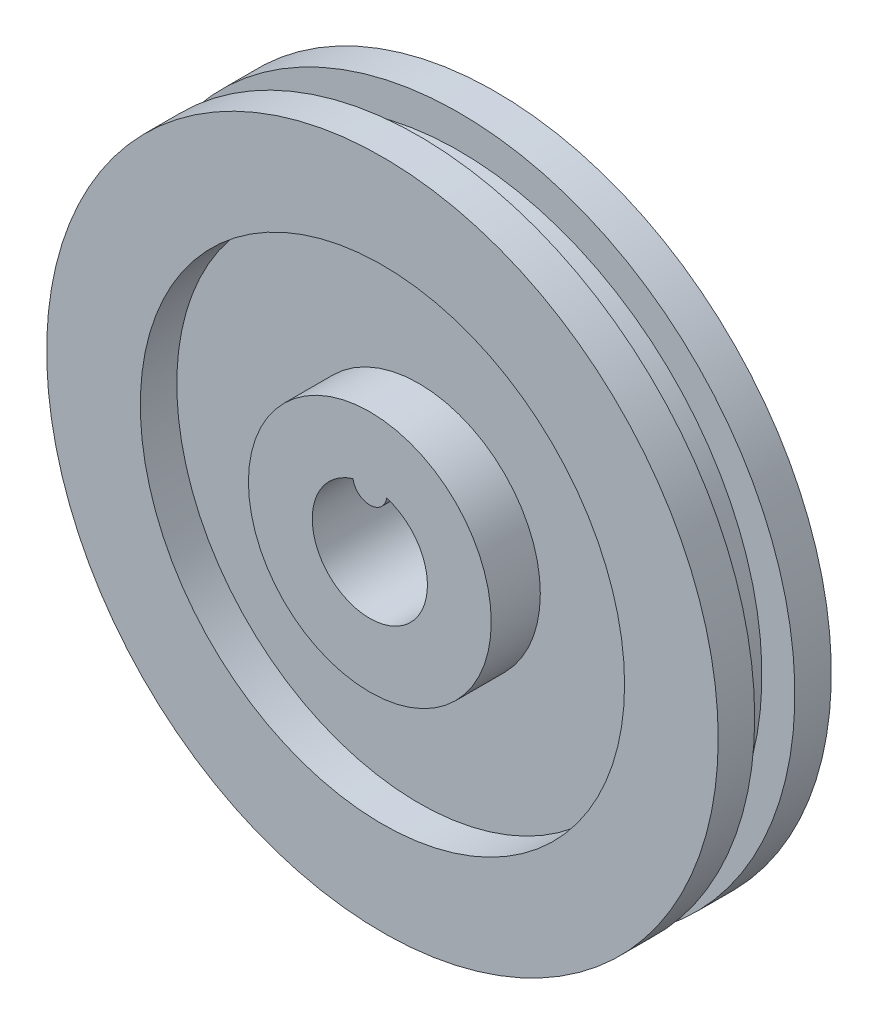
ISO-10303-21;
HEADER;
FILE_DESCRIPTION(('STEP AP214'),'2;1');
FILE_NAME('part.step','',(''),(''),'','','');
FILE_SCHEMA(('AUTOMOTIVE_DESIGN { 1 0 10303 214 1 1 1 1 }'));
ENDSEC;
DATA;
#1=APPLICATION_CONTEXT('core data for automotive mechanical design processes');
#2=APPLICATION_PROTOCOL_DEFINITION('international standard','automotive_design',2000,#1);
#3=PRODUCT_CONTEXT('',#1,'mechanical');
#4=PRODUCT('Part','Part','',(#3));
#5=PRODUCT_RELATED_PRODUCT_CATEGORY('part','',(#4));
#6=PRODUCT_DEFINITION_FORMATION('','',#4);
#7=PRODUCT_DEFINITION_CONTEXT('part definition',#1,'design');
#8=PRODUCT_DEFINITION('design','',#6,#7);
#9=PRODUCT_DEFINITION_SHAPE('','',#8);
#10=(LENGTH_UNIT() NAMED_UNIT(*) SI_UNIT(.MILLI.,.METRE.));
#11=(NAMED_UNIT(*) PLANE_ANGLE_UNIT() SI_UNIT($,.RADIAN.));
#12=(NAMED_UNIT(*) SI_UNIT($,.STERADIAN.) SOLID_ANGLE_UNIT());
#13=UNCERTAINTY_MEASURE_WITH_UNIT(LENGTH_MEASURE(1.E-05),#10,'distance_accuracy_value','');
#14=(GEOMETRIC_REPRESENTATION_CONTEXT(3) GLOBAL_UNCERTAINTY_ASSIGNED_CONTEXT((#13)) GLOBAL_UNIT_ASSIGNED_CONTEXT((#10,
#11,#12)) REPRESENTATION_CONTEXT('',''));
#15=CARTESIAN_POINT('',(0.,0.,0.));
#16=DIRECTION('',(0.,0.,1.));
#17=DIRECTION('',(1.,0.,0.));
#18=AXIS2_PLACEMENT_3D('',#15,#16,#17);
#19=CARTESIAN_POINT('',(0.,0.,-1.465));
#20=DIRECTION('',(0.,0.,1.));
#21=DIRECTION('',(1.,0.,0.));
#22=AXIS2_PLACEMENT_3D('',#19,#20,#21);
#23=PLANE('',#22);
#24=CARTESIAN_POINT('',(0.,0.,-1.465));
#25=DIRECTION('',(0.,0.,1.));
#26=DIRECTION('',(1.,0.,0.));
#27=AXIS2_PLACEMENT_3D('',#24,#25,#26);
#28=CIRCLE('',#27,8.855);
#29=CARTESIAN_POINT('',(8.855,0.,-1.465));
#30=VERTEX_POINT('',#29);
#31=EDGE_CURVE('E54',#30,#30,#28,.T.);
#32=ORIENTED_EDGE('',*,*,#31,.T.);
#33=EDGE_LOOP('',(#32));
#34=FACE_BOUND('',#33,.T.);
#35=CARTESIAN_POINT('',(0.,0.,-1.465));
#36=DIRECTION('',(0.,0.,-1.));
#37=DIRECTION('',(-1.,0.,0.));
#38=AXIS2_PLACEMENT_3D('',#35,#36,#37);
#39=CIRCLE('',#38,17.66);
#40=CARTESIAN_POINT('',(-17.66,0.,-1.465));
#41=VERTEX_POINT('',#40);
#42=EDGE_CURVE('E267',#41,#41,#39,.T.);
#43=ORIENTED_EDGE('',*,*,#42,.T.);
#44=EDGE_LOOP('',(#43));
#45=FACE_BOUND('',#44,.T.);
#46=ADVANCED_FACE('F45',(#34,#45),#23,.F.);
#47=CARTESIAN_POINT('',(0.,0.,1.465));
#48=DIRECTION('',(0.,0.,1.));
#49=DIRECTION('',(1.,0.,0.));
#50=AXIS2_PLACEMENT_3D('',#47,#48,#49);
#51=PLANE('',#50);
#52=CARTESIAN_POINT('',(0.,0.,1.465));
#53=DIRECTION('',(0.,0.,1.));
#54=DIRECTION('',(1.,0.,0.));
#55=AXIS2_PLACEMENT_3D('',#52,#53,#54);
#56=CIRCLE('',#55,8.855);
#57=CARTESIAN_POINT('',(8.855,0.,1.465));
#58=VERTEX_POINT('',#57);
#59=EDGE_CURVE('E93',#58,#58,#56,.T.);
#60=ORIENTED_EDGE('',*,*,#59,.F.);
#61=EDGE_LOOP('',(#60));
#62=FACE_BOUND('',#61,.T.);
#63=CARTESIAN_POINT('',(0.,0.,1.465));
#64=DIRECTION('',(0.,0.,1.));
#65=DIRECTION('',(1.,0.,0.));
#66=AXIS2_PLACEMENT_3D('',#63,#64,#65);
#67=CIRCLE('',#66,17.66);
#68=CARTESIAN_POINT('',(17.66,0.,1.465));
#69=VERTEX_POINT('',#68);
#70=EDGE_CURVE('E11',#69,#69,#67,.F.);
#71=ORIENTED_EDGE('',*,*,#70,.F.);
#72=EDGE_LOOP('',(#71));
#73=FACE_BOUND('',#72,.T.);
#74=ADVANCED_FACE('F116',(#62,#73),#51,.T.);
#75=CARTESIAN_POINT('',(0.,0.,5.045));
#76=DIRECTION('',(0.,0.,-1.));
#77=DIRECTION('',(-1.,0.,0.));
#78=AXIS2_PLACEMENT_3D('',#75,#76,#77);
#79=CYLINDRICAL_SURFACE('',#78,8.855);
#80=CARTESIAN_POINT('',(0.,0.,-5.045));
#81=DIRECTION('',(0.,0.,1.));
#82=DIRECTION('',(1.,0.,0.));
#83=AXIS2_PLACEMENT_3D('',#80,#81,#82);
#84=CIRCLE('',#83,8.855);
#85=CARTESIAN_POINT('',(8.855,0.,-5.045));
#86=VERTEX_POINT('',#85);
#87=EDGE_CURVE('E85',#86,#86,#84,.T.);
#88=ORIENTED_EDGE('',*,*,#87,.T.);
#89=EDGE_LOOP('',(#88));
#90=FACE_BOUND('',#89,.T.);
#91=ORIENTED_EDGE('',*,*,#31,.F.);
#92=EDGE_LOOP('',(#91));
#93=FACE_BOUND('',#92,.T.);
#94=ADVANCED_FACE('F113',(#90,#93),#79,.T.);
#95=CARTESIAN_POINT('',(0.,0.,5.045));
#96=DIRECTION('',(0.,0.,1.));
#97=DIRECTION('',(1.,0.,0.));
#98=AXIS2_PLACEMENT_3D('',#95,#96,#97);
#99=PLANE('',#98);
#100=CARTESIAN_POINT('',(0.,0.,5.045));
#101=DIRECTION('',(0.,0.,1.));
#102=DIRECTION('',(1.,0.,0.));
#103=AXIS2_PLACEMENT_3D('',#100,#101,#102);
#104=CIRCLE('',#103,8.855);
#105=CARTESIAN_POINT('',(8.855,0.,5.045));
#106=VERTEX_POINT('',#105);
#107=EDGE_CURVE('E101',#106,#106,#104,.T.);
#108=ORIENTED_EDGE('',*,*,#107,.T.);
#109=EDGE_LOOP('',(#108));
#110=FACE_BOUND('',#109,.T.);
#111=CARTESIAN_POINT('',(0.,0.,5.045));
#112=DIRECTION('',(0.,0.,1.));
#113=DIRECTION('',(1.,0.,0.));
#114=AXIS2_PLACEMENT_3D('',#111,#112,#113);
#115=CIRCLE('',#114,4.2);
#116=CARTESIAN_POINT('',(-1.22641492536621,4.01695238095238,5.045));
#117=VERTEX_POINT('',#116);
#118=CARTESIAN_POINT('',(1.2264149253662,4.01695238095238,5.045));
#119=VERTEX_POINT('',#118);
#120=EDGE_CURVE('E96',#117,#119,#115,.T.);
#121=ORIENTED_EDGE('',*,*,#120,.F.);
#122=CARTESIAN_POINT('',(0.,4.2,5.045));
#123=DIRECTION('',(0.,0.,-1.));
#124=DIRECTION('',(1.,0.,0.));
#125=AXIS2_PLACEMENT_3D('',#122,#123,#124);
#126=CIRCLE('',#125,1.24);
#127=EDGE_CURVE('E79',#119,#117,#126,.T.);
#128=ORIENTED_EDGE('',*,*,#127,.F.);
#129=EDGE_LOOP('',(#121,#128));
#130=FACE_BOUND('',#129,.T.);
#131=ADVANCED_FACE('F115',(#110,#130),#99,.T.);
#132=CARTESIAN_POINT('',(0.,0.,-5.045));
#133=DIRECTION('',(0.,0.,1.));
#134=DIRECTION('',(1.,0.,0.));
#135=AXIS2_PLACEMENT_3D('',#132,#133,#134);
#136=PLANE('',#135);
#137=ORIENTED_EDGE('',*,*,#87,.F.);
#138=EDGE_LOOP('',(#137));
#139=FACE_BOUND('',#138,.T.);
#140=CARTESIAN_POINT('',(0.,4.2,-5.045));
#141=DIRECTION('',(0.,0.,-1.));
#142=DIRECTION('',(1.,0.,0.));
#143=AXIS2_PLACEMENT_3D('',#140,#141,#142);
#144=CIRCLE('',#143,1.24);
#145=CARTESIAN_POINT('',(1.2264149253662,4.01695238095238,-5.045));
#146=VERTEX_POINT('',#145);
#147=CARTESIAN_POINT('',(-1.22641492536621,4.01695238095238,-5.045));
#148=VERTEX_POINT('',#147);
#149=EDGE_CURVE('E68',#146,#148,#144,.T.);
#150=ORIENTED_EDGE('',*,*,#149,.T.);
#151=CARTESIAN_POINT('',(0.,0.,-5.045));
#152=DIRECTION('',(0.,0.,1.));
#153=DIRECTION('',(1.,0.,0.));
#154=AXIS2_PLACEMENT_3D('',#151,#152,#153);
#155=CIRCLE('',#154,4.2);
#156=EDGE_CURVE('E74',#148,#146,#155,.T.);
#157=ORIENTED_EDGE('',*,*,#156,.T.);
#158=EDGE_LOOP('',(#150,#157));
#159=FACE_BOUND('',#158,.T.);
#160=ADVANCED_FACE('F87',(#139,#159),#136,.F.);
#161=ORIENTED_EDGE('',*,*,#59,.T.);
#162=EDGE_LOOP('',(#161));
#163=FACE_BOUND('',#162,.T.);
#164=ORIENTED_EDGE('',*,*,#107,.F.);
#165=EDGE_LOOP('',(#164));
#166=FACE_BOUND('',#165,.T.);
#167=ADVANCED_FACE('F47',(#163,#166),#79,.T.);
#168=CARTESIAN_POINT('',(0.,4.2,5.045));
#169=DIRECTION('',(0.,0.,-1.));
#170=DIRECTION('',(-1.,0.,0.));
#171=AXIS2_PLACEMENT_3D('',#168,#169,#170);
#172=CYLINDRICAL_SURFACE('',#171,1.24);
#173=ORIENTED_EDGE('',*,*,#149,.F.);
#174=DIRECTION('',(0.,0.,-1.));
#175=VECTOR('',#174,1.);
#176=CARTESIAN_POINT('',(1.2264149253662,4.01695238095238,5.045));
#177=LINE('',#176,#175);
#178=EDGE_CURVE('E76',#119,#146,#177,.T.);
#179=ORIENTED_EDGE('',*,*,#178,.F.);
#180=ORIENTED_EDGE('',*,*,#127,.T.);
#181=DIRECTION('',(0.,0.,-1.));
#182=VECTOR('',#181,1.);
#183=CARTESIAN_POINT('',(-1.22641492536621,4.01695238095238,5.045));
#184=LINE('',#183,#182);
#185=EDGE_CURVE('E61',#117,#148,#184,.T.);
#186=ORIENTED_EDGE('',*,*,#185,.T.);
#187=EDGE_LOOP('',(#173,#179,#180,#186));
#188=FACE_BOUND('',#187,.T.);
#189=ADVANCED_FACE('F81',(#188),#172,.T.);
#190=CARTESIAN_POINT('',(0.,0.,5.045));
#191=DIRECTION('',(0.,0.,-1.));
#192=DIRECTION('',(-1.,0.,0.));
#193=AXIS2_PLACEMENT_3D('',#190,#191,#192);
#194=CYLINDRICAL_SURFACE('',#193,4.2);
#195=ORIENTED_EDGE('',*,*,#156,.F.);
#196=ORIENTED_EDGE('',*,*,#185,.F.);
#197=ORIENTED_EDGE('',*,*,#120,.T.);
#198=ORIENTED_EDGE('',*,*,#178,.T.);
#199=EDGE_LOOP('',(#195,#196,#197,#198));
#200=FACE_BOUND('',#199,.T.);
#201=ADVANCED_FACE('F75',(#200),#194,.F.);
#202=CARTESIAN_POINT('',(0.,0.,1.465));
#203=DIRECTION('',(0.,0.,-1.));
#204=DIRECTION('',(-1.,0.,0.));
#205=AXIS2_PLACEMENT_3D('',#202,#203,#204);
#206=CYLINDRICAL_SURFACE('',#205,22.085);
#207=CARTESIAN_POINT('',(0.,0.,1.465));
#208=DIRECTION('',(0.,0.,1.));
#209=DIRECTION('',(1.,0.,0.));
#210=AXIS2_PLACEMENT_3D('',#207,#208,#209);
#211=CIRCLE('',#210,22.085);
#212=CARTESIAN_POINT('',(-22.085,0.,1.465));
#213=VERTEX_POINT('',#212);
#214=EDGE_CURVE('E89',#213,#213,#211,.T.);
#215=CARTESIAN_POINT('',(0.,0.,-1.465));
#216=DIRECTION('',(0.,0.,-1.));
#217=DIRECTION('',(-1.,0.,0.));
#218=AXIS2_PLACEMENT_3D('',#215,#216,#217);
#219=CIRCLE('',#218,22.085);
#220=CARTESIAN_POINT('',(-22.085,0.,-1.465));
#221=VERTEX_POINT('',#220);
#222=EDGE_CURVE('E278',#221,#221,#219,.T.);
#223=CARTESIAN_POINT('',(-22.085,0.,1.465));
#224=CARTESIAN_POINT('',(-22.085,0.,1.43447916666667));
#225=CARTESIAN_POINT('',(-22.085,0.,1.40395833333333));
#226=CARTESIAN_POINT('',(-22.085,0.,1.34291666666667));
#227=CARTESIAN_POINT('',(-22.085,0.,1.31239583333333));
#228=CARTESIAN_POINT('',(-22.085,0.,1.25135416666667));
#229=CARTESIAN_POINT('',(-22.085,0.,1.22083333333333));
#230=CARTESIAN_POINT('',(-22.085,0.,1.15979166666667));
#231=CARTESIAN_POINT('',(-22.085,0.,1.12927083333333));
#232=CARTESIAN_POINT('',(-22.085,0.,1.06822916666667));
#233=CARTESIAN_POINT('',(-22.085,0.,1.03770833333333));
#234=CARTESIAN_POINT('',(-22.085,0.,0.976666666666667));
#235=CARTESIAN_POINT('',(-22.085,0.,0.946145833333333));
#236=CARTESIAN_POINT('',(-22.085,0.,0.885104166666667));
#237=CARTESIAN_POINT('',(-22.085,0.,0.854583333333333));
#238=CARTESIAN_POINT('',(-22.085,0.,0.793541666666667));
#239=CARTESIAN_POINT('',(-22.085,0.,0.763020833333333));
#240=CARTESIAN_POINT('',(-22.085,0.,0.701979166666667));
#241=CARTESIAN_POINT('',(-22.085,0.,0.671458333333333));
#242=CARTESIAN_POINT('',(-22.085,0.,0.610416666666667));
#243=CARTESIAN_POINT('',(-22.085,0.,0.579895833333333));
#244=CARTESIAN_POINT('',(-22.085,0.,0.518854166666667));
#245=CARTESIAN_POINT('',(-22.085,0.,0.488333333333334));
#246=CARTESIAN_POINT('',(-22.085,0.,0.427291666666667));
#247=CARTESIAN_POINT('',(-22.085,0.,0.396770833333334));
#248=CARTESIAN_POINT('',(-22.085,0.,0.335729166666667));
#249=CARTESIAN_POINT('',(-22.085,0.,0.305208333333334));
#250=CARTESIAN_POINT('',(-22.085,0.,0.244166666666667));
#251=CARTESIAN_POINT('',(-22.085,0.,0.213645833333334));
#252=CARTESIAN_POINT('',(-22.085,0.,0.152604166666667));
#253=CARTESIAN_POINT('',(-22.085,0.,0.122083333333334));
#254=CARTESIAN_POINT('',(-22.085,0.,0.0610416666666669));
#255=CARTESIAN_POINT('',(-22.085,0.,0.0305208333333336));
#256=CARTESIAN_POINT('',(-22.085,0.,-0.0305208333333331));
#257=CARTESIAN_POINT('',(-22.085,0.,-0.0610416666666665));
#258=CARTESIAN_POINT('',(-22.085,0.,-0.122083333333333));
#259=CARTESIAN_POINT('',(-22.085,0.,-0.152604166666667));
#260=CARTESIAN_POINT('',(-22.085,0.,-0.213645833333333));
#261=CARTESIAN_POINT('',(-22.085,0.,-0.244166666666666));
#262=CARTESIAN_POINT('',(-22.085,0.,-0.305208333333333));
#263=CARTESIAN_POINT('',(-22.085,0.,-0.335729166666666));
#264=CARTESIAN_POINT('',(-22.085,0.,-0.396770833333333));
#265=CARTESIAN_POINT('',(-22.085,0.,-0.427291666666667));
#266=CARTESIAN_POINT('',(-22.085,0.,-0.488333333333333));
#267=CARTESIAN_POINT('',(-22.085,0.,-0.518854166666666));
#268=CARTESIAN_POINT('',(-22.085,0.,-0.579895833333333));
#269=CARTESIAN_POINT('',(-22.085,0.,-0.610416666666666));
#270=CARTESIAN_POINT('',(-22.085,0.,-0.671458333333333));
#271=CARTESIAN_POINT('',(-22.085,0.,-0.701979166666666));
#272=CARTESIAN_POINT('',(-22.085,0.,-0.763020833333333));
#273=CARTESIAN_POINT('',(-22.085,0.,-0.793541666666666));
#274=CARTESIAN_POINT('',(-22.085,0.,-0.854583333333333));
#275=CARTESIAN_POINT('',(-22.085,0.,-0.885104166666666));
#276=CARTESIAN_POINT('',(-22.085,0.,-0.946145833333333));
#277=CARTESIAN_POINT('',(-22.085,0.,-0.976666666666666));
#278=CARTESIAN_POINT('',(-22.085,0.,-1.03770833333333));
#279=CARTESIAN_POINT('',(-22.085,0.,-1.06822916666667));
#280=CARTESIAN_POINT('',(-22.085,0.,-1.12927083333333));
#281=CARTESIAN_POINT('',(-22.085,0.,-1.15979166666667));
#282=CARTESIAN_POINT('',(-22.085,0.,-1.22083333333333));
#283=CARTESIAN_POINT('',(-22.085,0.,-1.25135416666667));
#284=CARTESIAN_POINT('',(-22.085,0.,-1.31239583333333));
#285=CARTESIAN_POINT('',(-22.085,0.,-1.34291666666667));
#286=CARTESIAN_POINT('',(-22.085,0.,-1.40395833333333));
#287=CARTESIAN_POINT('',(-22.085,0.,-1.43447916666667));
#288=CARTESIAN_POINT('',(-22.085,0.,-1.465));
#289=B_SPLINE_CURVE_WITH_KNOTS('',3,(#223,#224,#225,#226,#227,#228,#229,#230,#231,#232,#233,
#234,#235,#236,#237,#238,#239,#240,#241,#242,#243,#244,#245,#246,#247,#248,#249,#250,#251,#252,
#253,#254,#255,#256,#257,#258,#259,#260,#261,#262,#263,#264,#265,#266,#267,#268,#269,#270,#271,
#272,#273,#274,#275,#276,#277,#278,#279,#280,#281,#282,#283,#284,#285,#286,#287,#288),
.UNSPECIFIED.,.F.,.F.,(4,2,2,2,2,2,2,2,2,2,2,2,2,2,2,2,2,2,2,2,2,2,2,2,2,2,2,2,2,2,2,2,4),(0.,
0.0915625000000001,0.183125,0.2746875,0.36625,0.4578125,0.549375,0.6409375,0.7325,0.8240625,
0.915625,1.0071875,1.09875,1.1903125,1.281875,1.3734375,1.465,1.5565625,1.648125,1.7396875,
1.83125,1.9228125,2.014375,2.1059375,2.1975,2.2890625,2.380625,2.4721875,2.56375,2.6553125,
2.746875,2.8384375,2.93),.UNSPECIFIED.);
#290=EDGE_CURVE('BSEAM137',#213,#221,#289,.T.);
#291=ORIENTED_EDGE('',*,*,#214,.F.);
#292=ORIENTED_EDGE('',*,*,#222,.F.);
#293=ORIENTED_EDGE('',*,*,#290,.T.);
#294=ORIENTED_EDGE('',*,*,#290,.F.);
#295=EDGE_LOOP('',(#291,#293,#292,#294));
#296=FACE_BOUND('',#295,.T.);
#297=ADVANCED_FACE('F137',(#296),#206,.T.);
#298=CARTESIAN_POINT('',(0.,0.,4.125));
#299=DIRECTION('',(0.,0.,1.));
#300=DIRECTION('',(1.,0.,0.));
#301=AXIS2_PLACEMENT_3D('',#298,#299,#300);
#302=PLANE('',#301);
#303=CARTESIAN_POINT('',(0.,0.,4.125));
#304=DIRECTION('',(0.,0.,1.));
#305=DIRECTION('',(1.,0.,0.));
#306=AXIS2_PLACEMENT_3D('',#303,#304,#305);
#307=CIRCLE('',#306,24.49);
#308=CARTESIAN_POINT('',(24.49,0.,4.125));
#309=VERTEX_POINT('',#308);
#310=EDGE_CURVE('E290',#309,#309,#307,.T.);
#311=ORIENTED_EDGE('',*,*,#310,.T.);
#312=EDGE_LOOP('',(#311));
#313=FACE_BOUND('',#312,.T.);
#314=CARTESIAN_POINT('',(0.,0.,4.125));
#315=DIRECTION('',(0.,0.,1.));
#316=DIRECTION('',(1.,0.,0.));
#317=AXIS2_PLACEMENT_3D('',#314,#315,#316);
#318=CIRCLE('',#317,17.66);
#319=CARTESIAN_POINT('',(17.66,0.,4.125));
#320=VERTEX_POINT('',#319);
#321=EDGE_CURVE('E285',#320,#320,#318,.T.);
#322=ORIENTED_EDGE('',*,*,#321,.F.);
#323=EDGE_LOOP('',(#322));
#324=FACE_BOUND('',#323,.T.);
#325=ADVANCED_FACE('F140',(#313,#324),#302,.T.);
#326=CARTESIAN_POINT('',(0.,0.,1.465));
#327=DIRECTION('',(0.,0.,1.));
#328=DIRECTION('',(1.,0.,0.));
#329=AXIS2_PLACEMENT_3D('',#326,#327,#328);
#330=PLANE('',#329);
#331=ORIENTED_EDGE('',*,*,#214,.T.);
#332=EDGE_LOOP('',(#331));
#333=FACE_BOUND('',#332,.T.);
#334=CARTESIAN_POINT('',(0.,0.,1.465));
#335=DIRECTION('',(0.,0.,1.));
#336=DIRECTION('',(1.,0.,0.));
#337=AXIS2_PLACEMENT_3D('',#334,#335,#336);
#338=CIRCLE('',#337,24.49);
#339=CARTESIAN_POINT('',(24.49,0.,1.465));
#340=VERTEX_POINT('',#339);
#341=EDGE_CURVE('E289',#340,#340,#338,.T.);
#342=ORIENTED_EDGE('',*,*,#341,.F.);
#343=EDGE_LOOP('',(#342));
#344=FACE_BOUND('',#343,.T.);
#345=ADVANCED_FACE('F187',(#333,#344),#330,.F.);
#346=CARTESIAN_POINT('',(0.,0.,4.125));
#347=DIRECTION('',(0.,0.,-1.));
#348=DIRECTION('',(-1.,0.,0.));
#349=AXIS2_PLACEMENT_3D('',#346,#347,#348);
#350=CYLINDRICAL_SURFACE('',#349,24.49);
#351=ORIENTED_EDGE('',*,*,#310,.F.);
#352=EDGE_LOOP('',(#351));
#353=FACE_BOUND('',#352,.T.);
#354=ORIENTED_EDGE('',*,*,#341,.T.);
#355=EDGE_LOOP('',(#354));
#356=FACE_BOUND('',#355,.T.);
#357=ADVANCED_FACE('F197',(#353,#356),#350,.T.);
#358=CARTESIAN_POINT('',(0.,0.,4.125));
#359=DIRECTION('',(0.,0.,-1.));
#360=DIRECTION('',(-1.,0.,0.));
#361=AXIS2_PLACEMENT_3D('',#358,#359,#360);
#362=CYLINDRICAL_SURFACE('',#361,17.66);
#363=ORIENTED_EDGE('',*,*,#321,.T.);
#364=EDGE_LOOP('',(#363));
#365=FACE_BOUND('',#364,.T.);
#366=ORIENTED_EDGE('',*,*,#70,.T.);
#367=EDGE_LOOP('',(#366));
#368=FACE_BOUND('',#367,.T.);
#369=ADVANCED_FACE('F207',(#365,#368),#362,.F.);
#370=CARTESIAN_POINT('',(0.,0.,-4.125));
#371=DIRECTION('',(0.,0.,-1.));
#372=DIRECTION('',(-1.,0.,0.));
#373=AXIS2_PLACEMENT_3D('',#370,#371,#372);
#374=PLANE('',#373);
#375=CARTESIAN_POINT('',(0.,0.,-4.125));
#376=DIRECTION('',(0.,0.,-1.));
#377=DIRECTION('',(-1.,0.,0.));
#378=AXIS2_PLACEMENT_3D('',#375,#376,#377);
#379=CIRCLE('',#378,24.49);
#380=CARTESIAN_POINT('',(-24.49,0.,-4.125));
#381=VERTEX_POINT('',#380);
#382=EDGE_CURVE('E274',#381,#381,#379,.T.);
#383=ORIENTED_EDGE('',*,*,#382,.T.);
#384=EDGE_LOOP('',(#383));
#385=FACE_BOUND('',#384,.T.);
#386=CARTESIAN_POINT('',(0.,0.,-4.125));
#387=DIRECTION('',(0.,0.,-1.));
#388=DIRECTION('',(-1.,0.,0.));
#389=AXIS2_PLACEMENT_3D('',#386,#387,#388);
#390=CIRCLE('',#389,17.66);
#391=CARTESIAN_POINT('',(-17.66,0.,-4.125));
#392=VERTEX_POINT('',#391);
#393=EDGE_CURVE('E264',#392,#392,#390,.T.);
#394=ORIENTED_EDGE('',*,*,#393,.F.);
#395=EDGE_LOOP('',(#394));
#396=FACE_BOUND('',#395,.T.);
#397=ADVANCED_FACE('F215',(#385,#396),#374,.T.);
#398=CARTESIAN_POINT('',(0.,0.,-1.465));
#399=DIRECTION('',(0.,0.,-1.));
#400=DIRECTION('',(-1.,0.,0.));
#401=AXIS2_PLACEMENT_3D('',#398,#399,#400);
#402=PLANE('',#401);
#403=ORIENTED_EDGE('',*,*,#222,.T.);
#404=EDGE_LOOP('',(#403));
#405=FACE_BOUND('',#404,.T.);
#406=CARTESIAN_POINT('',(0.,0.,-1.465));
#407=DIRECTION('',(0.,0.,-1.));
#408=DIRECTION('',(-1.,0.,0.));
#409=AXIS2_PLACEMENT_3D('',#406,#407,#408);
#410=CIRCLE('',#409,24.49);
#411=CARTESIAN_POINT('',(-24.49,0.,-1.465));
#412=VERTEX_POINT('',#411);
#413=EDGE_CURVE('E271',#412,#412,#410,.T.);
#414=ORIENTED_EDGE('',*,*,#413,.F.);
#415=EDGE_LOOP('',(#414));
#416=FACE_BOUND('',#415,.T.);
#417=ADVANCED_FACE('F228',(#405,#416),#402,.F.);
#418=CARTESIAN_POINT('',(0.,0.,-4.125));
#419=DIRECTION('',(0.,0.,1.));
#420=DIRECTION('',(1.,0.,0.));
#421=AXIS2_PLACEMENT_3D('',#418,#419,#420);
#422=CYLINDRICAL_SURFACE('',#421,24.49);
#423=ORIENTED_EDGE('',*,*,#382,.F.);
#424=EDGE_LOOP('',(#423));
#425=FACE_BOUND('',#424,.T.);
#426=ORIENTED_EDGE('',*,*,#413,.T.);
#427=EDGE_LOOP('',(#426));
#428=FACE_BOUND('',#427,.T.);
#429=ADVANCED_FACE('F238',(#425,#428),#422,.T.);
#430=CARTESIAN_POINT('',(0.,0.,-4.125));
#431=DIRECTION('',(0.,0.,1.));
#432=DIRECTION('',(1.,0.,0.));
#433=AXIS2_PLACEMENT_3D('',#430,#431,#432);
#434=CYLINDRICAL_SURFACE('',#433,17.66);
#435=ORIENTED_EDGE('',*,*,#393,.T.);
#436=EDGE_LOOP('',(#435));
#437=FACE_BOUND('',#436,.T.);
#438=ORIENTED_EDGE('',*,*,#42,.F.);
#439=EDGE_LOOP('',(#438));
#440=FACE_BOUND('',#439,.T.);
#441=ADVANCED_FACE('F248',(#437,#440),#434,.F.);
#442=CLOSED_SHELL('',(#46,#74,#94,#131,#160,#167,#189,#201,#297,#325,#345,#357,#369,#397,#417,
#429,#441));
#443=MANIFOLD_SOLID_BREP('B2',#442);
#444=ADVANCED_BREP_SHAPE_REPRESENTATION('',(#18,#443),#14);
#445=SHAPE_DEFINITION_REPRESENTATION(#9,#444);
ENDSEC;
END-ISO-10303-21;
